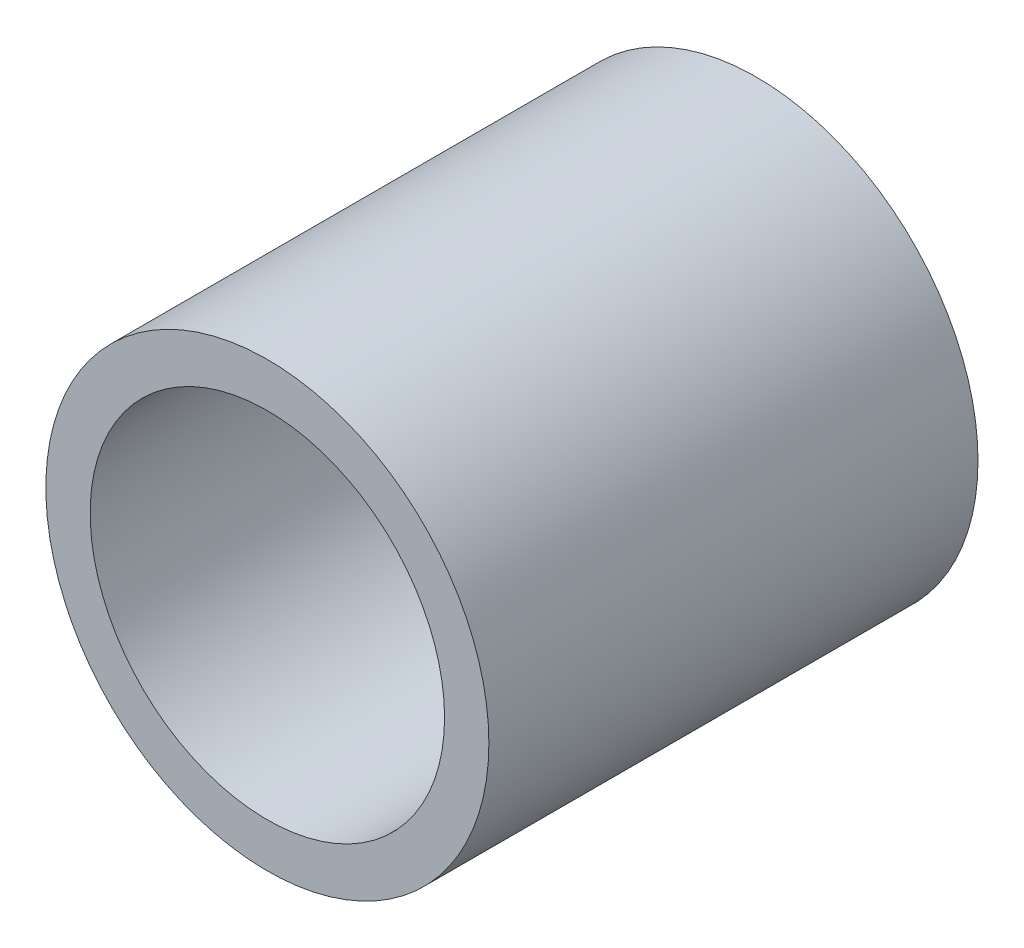
ISO-10303-21;
HEADER;
FILE_DESCRIPTION(('STEP AP214'),'2;1');
FILE_NAME('part.step','',(''),(''),'','','');
FILE_SCHEMA(('AUTOMOTIVE_DESIGN { 1 0 10303 214 1 1 1 1 }'));
ENDSEC;
DATA;
#1=APPLICATION_CONTEXT('core data for automotive mechanical design processes');
#2=APPLICATION_PROTOCOL_DEFINITION('international standard','automotive_design',2000,#1);
#3=PRODUCT_CONTEXT('',#1,'mechanical');
#4=PRODUCT('Part','Part','',(#3));
#5=PRODUCT_RELATED_PRODUCT_CATEGORY('part','',(#4));
#6=PRODUCT_DEFINITION_FORMATION('','',#4);
#7=PRODUCT_DEFINITION_CONTEXT('part definition',#1,'design');
#8=PRODUCT_DEFINITION('design','',#6,#7);
#9=PRODUCT_DEFINITION_SHAPE('','',#8);
#10=(LENGTH_UNIT() NAMED_UNIT(*) SI_UNIT(.MILLI.,.METRE.));
#11=(NAMED_UNIT(*) PLANE_ANGLE_UNIT() SI_UNIT($,.RADIAN.));
#12=(NAMED_UNIT(*) SI_UNIT($,.STERADIAN.) SOLID_ANGLE_UNIT());
#13=UNCERTAINTY_MEASURE_WITH_UNIT(LENGTH_MEASURE(1.E-05),#10,'distance_accuracy_value','');
#14=(GEOMETRIC_REPRESENTATION_CONTEXT(3) GLOBAL_UNCERTAINTY_ASSIGNED_CONTEXT((#13)) GLOBAL_UNIT_ASSIGNED_CONTEXT((#10,
#11,#12)) REPRESENTATION_CONTEXT('',''));
#15=CARTESIAN_POINT('',(0.,0.,0.));
#16=DIRECTION('',(0.,0.,1.));
#17=DIRECTION('',(1.,0.,0.));
#18=AXIS2_PLACEMENT_3D('',#15,#16,#17);
#19=CARTESIAN_POINT('',(0.,0.,1.38));
#20=DIRECTION('',(0.,0.,1.));
#21=DIRECTION('',(1.,0.,0.));
#22=AXIS2_PLACEMENT_3D('',#19,#20,#21);
#23=PLANE('',#22);
#24=CARTESIAN_POINT('',(0.,0.,1.38));
#25=DIRECTION('',(0.,0.,1.));
#26=DIRECTION('',(1.,0.,0.));
#27=AXIS2_PLACEMENT_3D('',#24,#25,#26);
#28=CIRCLE('',#27,0.625);
#29=CARTESIAN_POINT('',(0.625,0.,1.38));
#30=VERTEX_POINT('',#29);
#31=EDGE_CURVE('E10',#30,#30,#28,.T.);
#32=ORIENTED_EDGE('',*,*,#31,.T.);
#33=EDGE_LOOP('',(#32));
#34=FACE_BOUND('',#33,.T.);
#35=CARTESIAN_POINT('',(0.,0.,1.38));
#36=DIRECTION('',(0.,0.,1.));
#37=DIRECTION('',(1.,0.,0.));
#38=AXIS2_PLACEMENT_3D('',#35,#36,#37);
#39=CIRCLE('',#38,0.5);
#40=CARTESIAN_POINT('',(0.5,0.,1.38));
#41=VERTEX_POINT('',#40);
#42=EDGE_CURVE('E42',#41,#41,#39,.T.);
#43=ORIENTED_EDGE('',*,*,#42,.F.);
#44=EDGE_LOOP('',(#43));
#45=FACE_BOUND('',#44,.T.);
#46=ADVANCED_FACE('F31',(#34,#45),#23,.T.);
#47=CARTESIAN_POINT('',(0.,0.,0.));
#48=DIRECTION('',(0.,0.,1.));
#49=DIRECTION('',(1.,0.,0.));
#50=AXIS2_PLACEMENT_3D('',#47,#48,#49);
#51=PLANE('',#50);
#52=CARTESIAN_POINT('',(0.,0.,0.));
#53=DIRECTION('',(0.,0.,1.));
#54=DIRECTION('',(1.,0.,0.));
#55=AXIS2_PLACEMENT_3D('',#52,#53,#54);
#56=CIRCLE('',#55,0.625);
#57=CARTESIAN_POINT('',(0.625,0.,0.));
#58=VERTEX_POINT('',#57);
#59=EDGE_CURVE('E35',#58,#58,#56,.T.);
#60=ORIENTED_EDGE('',*,*,#59,.F.);
#61=EDGE_LOOP('',(#60));
#62=FACE_BOUND('',#61,.T.);
#63=CARTESIAN_POINT('',(0.,0.,0.));
#64=DIRECTION('',(0.,0.,1.));
#65=DIRECTION('',(1.,0.,0.));
#66=AXIS2_PLACEMENT_3D('',#63,#64,#65);
#67=CIRCLE('',#66,0.5);
#68=CARTESIAN_POINT('',(0.5,0.,0.));
#69=VERTEX_POINT('',#68);
#70=EDGE_CURVE('E44',#69,#69,#67,.T.);
#71=ORIENTED_EDGE('',*,*,#70,.T.);
#72=EDGE_LOOP('',(#71));
#73=FACE_BOUND('',#72,.T.);
#74=ADVANCED_FACE('F54',(#62,#73),#51,.F.);
#75=CARTESIAN_POINT('',(0.,0.,1.38));
#76=DIRECTION('',(0.,0.,-1.));
#77=DIRECTION('',(-1.,0.,0.));
#78=AXIS2_PLACEMENT_3D('',#75,#76,#77);
#79=CYLINDRICAL_SURFACE('',#78,0.625);
#80=ORIENTED_EDGE('',*,*,#31,.F.);
#81=EDGE_LOOP('',(#80));
#82=FACE_BOUND('',#81,.T.);
#83=ORIENTED_EDGE('',*,*,#59,.T.);
#84=EDGE_LOOP('',(#83));
#85=FACE_BOUND('',#84,.T.);
#86=ADVANCED_FACE('F33',(#82,#85),#79,.T.);
#87=CARTESIAN_POINT('',(0.,0.,1.38));
#88=DIRECTION('',(0.,0.,-1.));
#89=DIRECTION('',(-1.,0.,0.));
#90=AXIS2_PLACEMENT_3D('',#87,#88,#89);
#91=CYLINDRICAL_SURFACE('',#90,0.5);
#92=ORIENTED_EDGE('',*,*,#42,.T.);
#93=EDGE_LOOP('',(#92));
#94=FACE_BOUND('',#93,.T.);
#95=ORIENTED_EDGE('',*,*,#70,.F.);
#96=EDGE_LOOP('',(#95));
#97=FACE_BOUND('',#96,.T.);
#98=ADVANCED_FACE('F50',(#94,#97),#91,.F.);
#99=CLOSED_SHELL('',(#46,#74,#86,#98));
#100=MANIFOLD_SOLID_BREP('B2',#99);
#101=ADVANCED_BREP_SHAPE_REPRESENTATION('',(#18,#100),#14);
#102=SHAPE_DEFINITION_REPRESENTATION(#9,#101);
ENDSEC;
END-ISO-10303-21;
